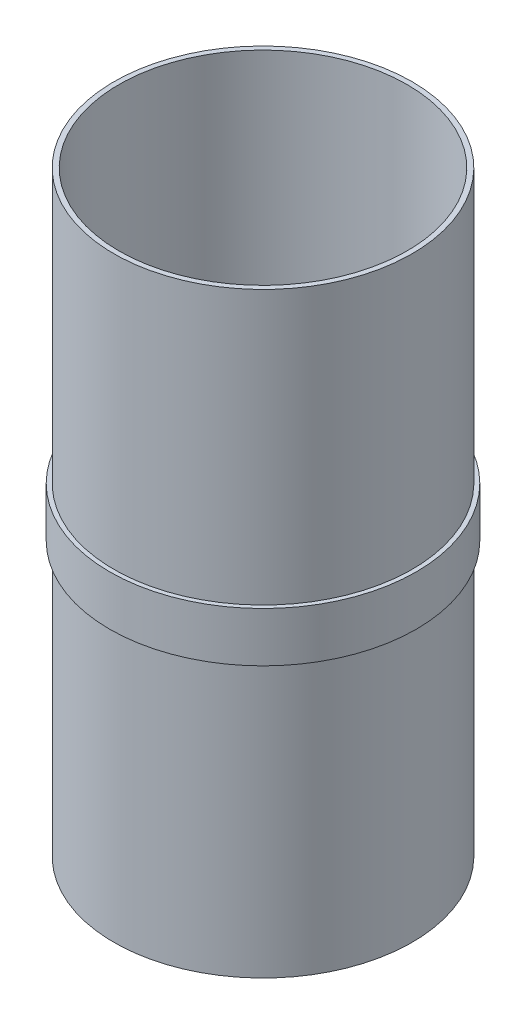
ISO-10303-21;
HEADER;
FILE_DESCRIPTION(('STEP AP214'),'2;1');
FILE_NAME('part.step','',(''),(''),'','','');
FILE_SCHEMA(('AUTOMOTIVE_DESIGN { 1 0 10303 214 1 1 1 1 }'));
ENDSEC;
DATA;
#1=APPLICATION_CONTEXT('core data for automotive mechanical design processes');
#2=APPLICATION_PROTOCOL_DEFINITION('international standard','automotive_design',2000,#1);
#3=PRODUCT_CONTEXT('',#1,'mechanical');
#4=PRODUCT('Part','Part','',(#3));
#5=PRODUCT_RELATED_PRODUCT_CATEGORY('part','',(#4));
#6=PRODUCT_DEFINITION_FORMATION('','',#4);
#7=PRODUCT_DEFINITION_CONTEXT('part definition',#1,'design');
#8=PRODUCT_DEFINITION('design','',#6,#7);
#9=PRODUCT_DEFINITION_SHAPE('','',#8);
#10=(LENGTH_UNIT() NAMED_UNIT(*) SI_UNIT(.MILLI.,.METRE.));
#11=(NAMED_UNIT(*) PLANE_ANGLE_UNIT() SI_UNIT($,.RADIAN.));
#12=(NAMED_UNIT(*) SI_UNIT($,.STERADIAN.) SOLID_ANGLE_UNIT());
#13=UNCERTAINTY_MEASURE_WITH_UNIT(LENGTH_MEASURE(1.E-05),#10,'distance_accuracy_value','');
#14=(GEOMETRIC_REPRESENTATION_CONTEXT(3) GLOBAL_UNCERTAINTY_ASSIGNED_CONTEXT((#13)) GLOBAL_UNIT_ASSIGNED_CONTEXT((#10,
#11,#12)) REPRESENTATION_CONTEXT('',''));
#15=CARTESIAN_POINT('',(0.,0.,0.));
#16=DIRECTION('',(0.,0.,1.));
#17=DIRECTION('',(1.,0.,0.));
#18=AXIS2_PLACEMENT_3D('',#15,#16,#17);
#19=CARTESIAN_POINT('',(0.,12.7,0.));
#20=DIRECTION('',(0.,1.,0.));
#21=DIRECTION('',(0.,0.,1.));
#22=AXIS2_PLACEMENT_3D('',#19,#20,#21);
#23=PLANE('',#22);
#24=CARTESIAN_POINT('',(0.,12.7,0.));
#25=DIRECTION('',(0.,1.,0.));
#26=DIRECTION('',(0.,0.,1.));
#27=AXIS2_PLACEMENT_3D('',#24,#25,#26);
#28=CIRCLE('',#27,78.359);
#29=CARTESIAN_POINT('',(0.,12.7,78.359));
#30=VERTEX_POINT('',#29);
#31=EDGE_CURVE('E10',#30,#30,#28,.T.);
#32=ORIENTED_EDGE('',*,*,#31,.T.);
#33=EDGE_LOOP('',(#32));
#34=FACE_BOUND('',#33,.T.);
#35=CARTESIAN_POINT('',(0.,12.7,0.));
#36=DIRECTION('',(0.,1.,0.));
#37=DIRECTION('',(0.,0.,1.));
#38=AXIS2_PLACEMENT_3D('',#35,#36,#37);
#39=CIRCLE('',#38,76.2);
#40=CARTESIAN_POINT('',(0.,12.7,-76.2));
#41=VERTEX_POINT('',#40);
#42=EDGE_CURVE('E48',#41,#41,#39,.T.);
#43=ORIENTED_EDGE('',*,*,#42,.F.);
#44=EDGE_LOOP('',(#43));
#45=FACE_BOUND('',#44,.T.);
#46=ADVANCED_FACE('F40',(#34,#45),#23,.T.);
#47=CARTESIAN_POINT('',(0.,-12.7,0.));
#48=DIRECTION('',(0.,1.,0.));
#49=DIRECTION('',(0.,0.,1.));
#50=AXIS2_PLACEMENT_3D('',#47,#48,#49);
#51=PLANE('',#50);
#52=CARTESIAN_POINT('',(0.,-12.7,0.));
#53=DIRECTION('',(0.,1.,0.));
#54=DIRECTION('',(0.,0.,1.));
#55=AXIS2_PLACEMENT_3D('',#52,#53,#54);
#56=CIRCLE('',#55,78.359);
#57=CARTESIAN_POINT('',(0.,-12.7,78.359));
#58=VERTEX_POINT('',#57);
#59=EDGE_CURVE('E41',#58,#58,#56,.T.);
#60=ORIENTED_EDGE('',*,*,#59,.F.);
#61=EDGE_LOOP('',(#60));
#62=FACE_BOUND('',#61,.T.);
#63=CARTESIAN_POINT('',(0.,-12.7,0.));
#64=DIRECTION('',(0.,1.,0.));
#65=DIRECTION('',(0.,0.,1.));
#66=AXIS2_PLACEMENT_3D('',#63,#64,#65);
#67=CIRCLE('',#66,76.2);
#68=CARTESIAN_POINT('',(0.,-12.7,-76.2));
#69=VERTEX_POINT('',#68);
#70=EDGE_CURVE('E55',#69,#69,#67,.F.);
#71=ORIENTED_EDGE('',*,*,#70,.F.);
#72=EDGE_LOOP('',(#71));
#73=FACE_BOUND('',#72,.T.);
#74=ADVANCED_FACE('F86',(#62,#73),#51,.F.);
#75=CARTESIAN_POINT('',(0.,12.7,0.));
#76=DIRECTION('',(0.,-1.,0.));
#77=DIRECTION('',(0.,0.,-1.));
#78=AXIS2_PLACEMENT_3D('',#75,#76,#77);
#79=CYLINDRICAL_SURFACE('',#78,78.359);
#80=ORIENTED_EDGE('',*,*,#31,.F.);
#81=EDGE_LOOP('',(#80));
#82=FACE_BOUND('',#81,.T.);
#83=ORIENTED_EDGE('',*,*,#59,.T.);
#84=EDGE_LOOP('',(#83));
#85=FACE_BOUND('',#84,.T.);
#86=ADVANCED_FACE('F39',(#82,#85),#79,.T.);
#87=CARTESIAN_POINT('',(0.,152.4,0.));
#88=DIRECTION('',(0.,-1.,0.));
#89=DIRECTION('',(0.,0.,-1.));
#90=AXIS2_PLACEMENT_3D('',#87,#88,#89);
#91=CYLINDRICAL_SURFACE('',#90,76.2);
#92=CARTESIAN_POINT('',(0.,-152.4,0.));
#93=DIRECTION('',(0.,1.,0.));
#94=DIRECTION('',(0.,0.,1.));
#95=AXIS2_PLACEMENT_3D('',#92,#93,#94);
#96=CIRCLE('',#95,76.2);
#97=CARTESIAN_POINT('',(0.,-152.4,-76.2));
#98=VERTEX_POINT('',#97);
#99=EDGE_CURVE('E57',#98,#98,#96,.T.);
#100=CARTESIAN_POINT('',(0.,-152.4,-76.2));
#101=CARTESIAN_POINT('',(0.,-150.944791666667,-76.2));
#102=CARTESIAN_POINT('',(0.,-149.489583333333,-76.2));
#103=CARTESIAN_POINT('',(0.,-146.579166666667,-76.2));
#104=CARTESIAN_POINT('',(0.,-145.123958333333,-76.2));
#105=CARTESIAN_POINT('',(0.,-142.213541666667,-76.2));
#106=CARTESIAN_POINT('',(0.,-140.758333333333,-76.2));
#107=CARTESIAN_POINT('',(0.,-137.847916666667,-76.2));
#108=CARTESIAN_POINT('',(0.,-136.392708333333,-76.2));
#109=CARTESIAN_POINT('',(0.,-133.482291666667,-76.2));
#110=CARTESIAN_POINT('',(0.,-132.027083333333,-76.2));
#111=CARTESIAN_POINT('',(0.,-129.116666666667,-76.2));
#112=CARTESIAN_POINT('',(0.,-127.661458333333,-76.2));
#113=CARTESIAN_POINT('',(0.,-124.751041666667,-76.2));
#114=CARTESIAN_POINT('',(0.,-123.295833333333,-76.2));
#115=CARTESIAN_POINT('',(0.,-120.385416666667,-76.2));
#116=CARTESIAN_POINT('',(0.,-118.930208333333,-76.2));
#117=CARTESIAN_POINT('',(0.,-116.019791666667,-76.2));
#118=CARTESIAN_POINT('',(0.,-114.564583333333,-76.2));
#119=CARTESIAN_POINT('',(0.,-111.654166666667,-76.2));
#120=CARTESIAN_POINT('',(0.,-110.198958333333,-76.2));
#121=CARTESIAN_POINT('',(0.,-107.288541666667,-76.2));
#122=CARTESIAN_POINT('',(0.,-105.833333333333,-76.2));
#123=CARTESIAN_POINT('',(0.,-102.922916666667,-76.2));
#124=CARTESIAN_POINT('',(0.,-101.467708333333,-76.2));
#125=CARTESIAN_POINT('',(0.,-98.5572916666667,-76.2));
#126=CARTESIAN_POINT('',(0.,-97.1020833333333,-76.2));
#127=CARTESIAN_POINT('',(0.,-94.1916666666667,-76.2));
#128=CARTESIAN_POINT('',(0.,-92.7364583333333,-76.2));
#129=CARTESIAN_POINT('',(0.,-89.8260416666667,-76.2));
#130=CARTESIAN_POINT('',(0.,-88.3708333333333,-76.2));
#131=CARTESIAN_POINT('',(0.,-85.4604166666667,-76.2));
#132=CARTESIAN_POINT('',(0.,-84.0052083333333,-76.2));
#133=CARTESIAN_POINT('',(0.,-81.0947916666667,-76.2));
#134=CARTESIAN_POINT('',(0.,-79.6395833333334,-76.2));
#135=CARTESIAN_POINT('',(0.,-76.7291666666667,-76.2));
#136=CARTESIAN_POINT('',(0.,-75.2739583333334,-76.2));
#137=CARTESIAN_POINT('',(0.,-72.3635416666667,-76.2));
#138=CARTESIAN_POINT('',(0.,-70.9083333333333,-76.2));
#139=CARTESIAN_POINT('',(0.,-67.9979166666667,-76.2));
#140=CARTESIAN_POINT('',(0.,-66.5427083333334,-76.2));
#141=CARTESIAN_POINT('',(0.,-63.6322916666667,-76.2));
#142=CARTESIAN_POINT('',(0.,-62.1770833333333,-76.2));
#143=CARTESIAN_POINT('',(0.,-59.2666666666667,-76.2));
#144=CARTESIAN_POINT('',(0.,-57.8114583333333,-76.2));
#145=CARTESIAN_POINT('',(0.,-54.9010416666667,-76.2));
#146=CARTESIAN_POINT('',(0.,-53.4458333333333,-76.2));
#147=CARTESIAN_POINT('',(0.,-50.5354166666667,-76.2));
#148=CARTESIAN_POINT('',(0.,-49.0802083333333,-76.2));
#149=CARTESIAN_POINT('',(0.,-46.1697916666667,-76.2));
#150=CARTESIAN_POINT('',(0.,-44.7145833333333,-76.2));
#151=CARTESIAN_POINT('',(0.,-41.8041666666667,-76.2));
#152=CARTESIAN_POINT('',(0.,-40.3489583333333,-76.2));
#153=CARTESIAN_POINT('',(0.,-37.4385416666667,-76.2));
#154=CARTESIAN_POINT('',(0.,-35.9833333333333,-76.2));
#155=CARTESIAN_POINT('',(0.,-33.0729166666667,-76.2));
#156=CARTESIAN_POINT('',(0.,-31.6177083333333,-76.2));
#157=CARTESIAN_POINT('',(0.,-28.7072916666667,-76.2));
#158=CARTESIAN_POINT('',(0.,-27.2520833333333,-76.2));
#159=CARTESIAN_POINT('',(0.,-24.3416666666667,-76.2));
#160=CARTESIAN_POINT('',(0.,-22.8864583333333,-76.2));
#161=CARTESIAN_POINT('',(0.,-19.9760416666667,-76.2));
#162=CARTESIAN_POINT('',(0.,-18.5208333333333,-76.2));
#163=CARTESIAN_POINT('',(0.,-15.6104166666667,-76.2));
#164=CARTESIAN_POINT('',(0.,-14.1552083333333,-76.2));
#165=CARTESIAN_POINT('',(0.,-12.7,-76.2));
#166=B_SPLINE_CURVE_WITH_KNOTS('',3,(#100,#101,#102,#103,#104,#105,#106,#107,#108,#109,#110,
#111,#112,#113,#114,#115,#116,#117,#118,#119,#120,#121,#122,#123,#124,#125,#126,#127,#128,#129,
#130,#131,#132,#133,#134,#135,#136,#137,#138,#139,#140,#141,#142,#143,#144,#145,#146,#147,#148,
#149,#150,#151,#152,#153,#154,#155,#156,#157,#158,#159,#160,#161,#162,#163,#164,#165),
.UNSPECIFIED.,.F.,.F.,(4,2,2,2,2,2,2,2,2,2,2,2,2,2,2,2,2,2,2,2,2,2,2,2,2,2,2,2,2,2,2,2,4),(0.,
4.36562499999998,8.73125000000002,13.096875,17.4625,21.828125,26.19375,30.559375,34.925,
39.290625,43.65625,48.021875,52.3875,56.753125,61.11875,65.484375,69.85,74.215625,78.58125,
82.946875,87.3125,91.678125,96.04375,100.409375,104.775,109.140625,113.50625,117.871875,
122.2375,126.603125,130.96875,135.334375,139.7),.UNSPECIFIED.);
#167=EDGE_CURVE('BSEAM74',#98,#69,#166,.T.);
#168=ORIENTED_EDGE('',*,*,#99,.T.);
#169=ORIENTED_EDGE('',*,*,#70,.T.);
#170=ORIENTED_EDGE('',*,*,#167,.T.);
#171=ORIENTED_EDGE('',*,*,#167,.F.);
#172=EDGE_LOOP('',(#168,#170,#169,#171));
#173=FACE_BOUND('',#172,.T.);
#174=ADVANCED_FACE('F74',(#173),#91,.T.);
#175=CARTESIAN_POINT('',(0.,152.4,0.));
#176=DIRECTION('',(0.,1.,0.));
#177=DIRECTION('',(0.,0.,1.));
#178=AXIS2_PLACEMENT_3D('',#175,#176,#177);
#179=PLANE('',#178);
#180=CARTESIAN_POINT('',(0.,152.4,0.));
#181=DIRECTION('',(0.,1.,0.));
#182=DIRECTION('',(0.,0.,1.));
#183=AXIS2_PLACEMENT_3D('',#180,#181,#182);
#184=CIRCLE('',#183,76.2);
#185=CARTESIAN_POINT('',(0.,152.4,-76.2));
#186=VERTEX_POINT('',#185);
#187=EDGE_CURVE('E54',#186,#186,#184,.T.);
#188=ORIENTED_EDGE('',*,*,#187,.T.);
#189=EDGE_LOOP('',(#188));
#190=FACE_BOUND('',#189,.T.);
#191=CARTESIAN_POINT('',(0.,152.4,0.));
#192=DIRECTION('',(0.,1.,0.));
#193=DIRECTION('',(0.,0.,1.));
#194=AXIS2_PLACEMENT_3D('',#191,#192,#193);
#195=CIRCLE('',#194,73.66);
#196=CARTESIAN_POINT('',(0.,152.4,-73.66));
#197=VERTEX_POINT('',#196);
#198=EDGE_CURVE('E56',#197,#197,#195,.T.);
#199=ORIENTED_EDGE('',*,*,#198,.F.);
#200=EDGE_LOOP('',(#199));
#201=FACE_BOUND('',#200,.T.);
#202=ADVANCED_FACE('F72',(#190,#201),#179,.T.);
#203=CARTESIAN_POINT('',(0.,-152.4,0.));
#204=DIRECTION('',(0.,1.,0.));
#205=DIRECTION('',(0.,0.,1.));
#206=AXIS2_PLACEMENT_3D('',#203,#204,#205);
#207=PLANE('',#206);
#208=ORIENTED_EDGE('',*,*,#99,.F.);
#209=EDGE_LOOP('',(#208));
#210=FACE_BOUND('',#209,.T.);
#211=CARTESIAN_POINT('',(0.,-152.4,0.));
#212=DIRECTION('',(0.,1.,0.));
#213=DIRECTION('',(0.,0.,1.));
#214=AXIS2_PLACEMENT_3D('',#211,#212,#213);
#215=CIRCLE('',#214,73.66);
#216=CARTESIAN_POINT('',(0.,-152.4,-73.66));
#217=VERTEX_POINT('',#216);
#218=EDGE_CURVE('E65',#217,#217,#215,.T.);
#219=ORIENTED_EDGE('',*,*,#218,.T.);
#220=EDGE_LOOP('',(#219));
#221=FACE_BOUND('',#220,.T.);
#222=ADVANCED_FACE('F71',(#210,#221),#207,.F.);
#223=CARTESIAN_POINT('',(0.,12.7,-76.2));
#224=CARTESIAN_POINT('',(0.,14.1552083333333,-76.2));
#225=CARTESIAN_POINT('',(0.,15.6104166666667,-76.2));
#226=CARTESIAN_POINT('',(0.,18.5208333333333,-76.2));
#227=CARTESIAN_POINT('',(0.,19.9760416666667,-76.2));
#228=CARTESIAN_POINT('',(0.,22.8864583333333,-76.2));
#229=CARTESIAN_POINT('',(0.,24.3416666666667,-76.2));
#230=CARTESIAN_POINT('',(0.,27.2520833333333,-76.2));
#231=CARTESIAN_POINT('',(0.,28.7072916666667,-76.2));
#232=CARTESIAN_POINT('',(0.,31.6177083333333,-76.2));
#233=CARTESIAN_POINT('',(0.,33.0729166666666,-76.2));
#234=CARTESIAN_POINT('',(0.,35.9833333333333,-76.2));
#235=CARTESIAN_POINT('',(0.,37.4385416666667,-76.2));
#236=CARTESIAN_POINT('',(0.,40.3489583333333,-76.2));
#237=CARTESIAN_POINT('',(0.,41.8041666666667,-76.2));
#238=CARTESIAN_POINT('',(0.,44.7145833333333,-76.2));
#239=CARTESIAN_POINT('',(0.,46.1697916666667,-76.2));
#240=CARTESIAN_POINT('',(0.,49.0802083333333,-76.2));
#241=CARTESIAN_POINT('',(0.,50.5354166666666,-76.2));
#242=CARTESIAN_POINT('',(0.,53.4458333333333,-76.2));
#243=CARTESIAN_POINT('',(0.,54.9010416666667,-76.2));
#244=CARTESIAN_POINT('',(0.,57.8114583333333,-76.2));
#245=CARTESIAN_POINT('',(0.,59.2666666666667,-76.2));
#246=CARTESIAN_POINT('',(0.,62.1770833333333,-76.2));
#247=CARTESIAN_POINT('',(0.,63.6322916666667,-76.2));
#248=CARTESIAN_POINT('',(0.,66.5427083333333,-76.2));
#249=CARTESIAN_POINT('',(0.,67.9979166666667,-76.2));
#250=CARTESIAN_POINT('',(0.,70.9083333333333,-76.2));
#251=CARTESIAN_POINT('',(0.,72.3635416666667,-76.2));
#252=CARTESIAN_POINT('',(0.,75.2739583333333,-76.2));
#253=CARTESIAN_POINT('',(0.,76.7291666666667,-76.2));
#254=CARTESIAN_POINT('',(0.,79.6395833333333,-76.2));
#255=CARTESIAN_POINT('',(0.,81.0947916666667,-76.2));
#256=CARTESIAN_POINT('',(0.,84.0052083333333,-76.2));
#257=CARTESIAN_POINT('',(0.,85.4604166666667,-76.2));
#258=CARTESIAN_POINT('',(0.,88.3708333333333,-76.2));
#259=CARTESIAN_POINT('',(0.,89.8260416666667,-76.2));
#260=CARTESIAN_POINT('',(0.,92.7364583333333,-76.2));
#261=CARTESIAN_POINT('',(0.,94.1916666666667,-76.2));
#262=CARTESIAN_POINT('',(0.,97.1020833333333,-76.2));
#263=CARTESIAN_POINT('',(0.,98.5572916666667,-76.2));
#264=CARTESIAN_POINT('',(0.,101.467708333333,-76.2));
#265=CARTESIAN_POINT('',(0.,102.922916666667,-76.2));
#266=CARTESIAN_POINT('',(0.,105.833333333333,-76.2));
#267=CARTESIAN_POINT('',(0.,107.288541666667,-76.2));
#268=CARTESIAN_POINT('',(0.,110.198958333333,-76.2));
#269=CARTESIAN_POINT('',(0.,111.654166666667,-76.2));
#270=CARTESIAN_POINT('',(0.,114.564583333333,-76.2));
#271=CARTESIAN_POINT('',(0.,116.019791666667,-76.2));
#272=CARTESIAN_POINT('',(0.,118.930208333333,-76.2));
#273=CARTESIAN_POINT('',(0.,120.385416666667,-76.2));
#274=CARTESIAN_POINT('',(0.,123.295833333333,-76.2));
#275=CARTESIAN_POINT('',(0.,124.751041666667,-76.2));
#276=CARTESIAN_POINT('',(0.,127.661458333333,-76.2));
#277=CARTESIAN_POINT('',(0.,129.116666666667,-76.2));
#278=CARTESIAN_POINT('',(0.,132.027083333333,-76.2));
#279=CARTESIAN_POINT('',(0.,133.482291666667,-76.2));
#280=CARTESIAN_POINT('',(0.,136.392708333333,-76.2));
#281=CARTESIAN_POINT('',(0.,137.847916666667,-76.2));
#282=CARTESIAN_POINT('',(0.,140.758333333333,-76.2));
#283=CARTESIAN_POINT('',(0.,142.213541666667,-76.2));
#284=CARTESIAN_POINT('',(0.,145.123958333333,-76.2));
#285=CARTESIAN_POINT('',(0.,146.579166666667,-76.2));
#286=CARTESIAN_POINT('',(0.,149.489583333333,-76.2));
#287=CARTESIAN_POINT('',(0.,150.944791666667,-76.2));
#288=CARTESIAN_POINT('',(0.,152.4,-76.2));
#289=B_SPLINE_CURVE_WITH_KNOTS('',3,(#223,#224,#225,#226,#227,#228,#229,#230,#231,#232,#233,
#234,#235,#236,#237,#238,#239,#240,#241,#242,#243,#244,#245,#246,#247,#248,#249,#250,#251,#252,
#253,#254,#255,#256,#257,#258,#259,#260,#261,#262,#263,#264,#265,#266,#267,#268,#269,#270,#271,
#272,#273,#274,#275,#276,#277,#278,#279,#280,#281,#282,#283,#284,#285,#286,#287,#288),
.UNSPECIFIED.,.F.,.F.,(4,2,2,2,2,2,2,2,2,2,2,2,2,2,2,2,2,2,2,2,2,2,2,2,2,2,2,2,2,2,2,2,4),(0.,
4.36562500000001,8.73125,13.096875,17.4625,21.828125,26.19375,30.559375,34.925,39.290625,
43.65625,48.021875,52.3875,56.753125,61.11875,65.484375,69.85,74.215625,78.58125,82.946875,
87.3125,91.678125,96.04375,100.409375,104.775,109.140625,113.50625,117.871875,122.2375,
126.603125,130.96875,135.334375,139.7),.UNSPECIFIED.);
#290=EDGE_CURVE('BSEAM81',#41,#186,#289,.T.);
#291=ORIENTED_EDGE('',*,*,#42,.T.);
#292=ORIENTED_EDGE('',*,*,#187,.F.);
#293=ORIENTED_EDGE('',*,*,#290,.T.);
#294=ORIENTED_EDGE('',*,*,#290,.F.);
#295=EDGE_LOOP('',(#291,#293,#292,#294));
#296=FACE_BOUND('',#295,.T.);
#297=ADVANCED_FACE('F81',(#296),#91,.T.);
#298=CARTESIAN_POINT('',(0.,152.4,0.));
#299=DIRECTION('',(0.,-1.,0.));
#300=DIRECTION('',(0.,0.,-1.));
#301=AXIS2_PLACEMENT_3D('',#298,#299,#300);
#302=CYLINDRICAL_SURFACE('',#301,73.66);
#303=CARTESIAN_POINT('',(0.,152.4,-73.66));
#304=CARTESIAN_POINT('',(0.,149.225,-73.66));
#305=CARTESIAN_POINT('',(0.,146.05,-73.66));
#306=CARTESIAN_POINT('',(0.,139.7,-73.66));
#307=CARTESIAN_POINT('',(0.,136.525,-73.66));
#308=CARTESIAN_POINT('',(0.,130.175,-73.66));
#309=CARTESIAN_POINT('',(0.,127.,-73.66));
#310=CARTESIAN_POINT('',(0.,120.65,-73.66));
#311=CARTESIAN_POINT('',(0.,117.475,-73.66));
#312=CARTESIAN_POINT('',(0.,111.125,-73.66));
#313=CARTESIAN_POINT('',(0.,107.95,-73.66));
#314=CARTESIAN_POINT('',(0.,101.6,-73.66));
#315=CARTESIAN_POINT('',(0.,98.425,-73.66));
#316=CARTESIAN_POINT('',(0.,92.075,-73.66));
#317=CARTESIAN_POINT('',(0.,88.9,-73.66));
#318=CARTESIAN_POINT('',(0.,82.55,-73.66));
#319=CARTESIAN_POINT('',(0.,79.375,-73.66));
#320=CARTESIAN_POINT('',(0.,73.025,-73.66));
#321=CARTESIAN_POINT('',(0.,69.85,-73.66));
#322=CARTESIAN_POINT('',(0.,63.5,-73.66));
#323=CARTESIAN_POINT('',(0.,60.325,-73.66));
#324=CARTESIAN_POINT('',(0.,53.975,-73.66));
#325=CARTESIAN_POINT('',(0.,50.8,-73.66));
#326=CARTESIAN_POINT('',(0.,44.45,-73.66));
#327=CARTESIAN_POINT('',(0.,41.275,-73.66));
#328=CARTESIAN_POINT('',(0.,34.925,-73.66));
#329=CARTESIAN_POINT('',(0.,31.75,-73.66));
#330=CARTESIAN_POINT('',(0.,25.4,-73.66));
#331=CARTESIAN_POINT('',(0.,22.225,-73.66));
#332=CARTESIAN_POINT('',(0.,15.875,-73.66));
#333=CARTESIAN_POINT('',(0.,12.7,-73.66));
#334=CARTESIAN_POINT('',(0.,6.34999999999998,-73.66));
#335=CARTESIAN_POINT('',(0.,3.17499999999997,-73.66));
#336=CARTESIAN_POINT('',(0.,-3.17500000000003,-73.66));
#337=CARTESIAN_POINT('',(0.,-6.35000000000003,-73.66));
#338=CARTESIAN_POINT('',(0.,-12.7,-73.66));
#339=CARTESIAN_POINT('',(0.,-15.875,-73.66));
#340=CARTESIAN_POINT('',(0.,-22.225,-73.66));
#341=CARTESIAN_POINT('',(0.,-25.4,-73.66));
#342=CARTESIAN_POINT('',(0.,-31.75,-73.66));
#343=CARTESIAN_POINT('',(0.,-34.925,-73.66));
#344=CARTESIAN_POINT('',(0.,-41.275,-73.66));
#345=CARTESIAN_POINT('',(0.,-44.45,-73.66));
#346=CARTESIAN_POINT('',(0.,-50.8,-73.66));
#347=CARTESIAN_POINT('',(0.,-53.975,-73.66));
#348=CARTESIAN_POINT('',(0.,-60.325,-73.66));
#349=CARTESIAN_POINT('',(0.,-63.5,-73.66));
#350=CARTESIAN_POINT('',(0.,-69.85,-73.66));
#351=CARTESIAN_POINT('',(0.,-73.025,-73.66));
#352=CARTESIAN_POINT('',(0.,-79.375,-73.66));
#353=CARTESIAN_POINT('',(0.,-82.5500000000001,-73.66));
#354=CARTESIAN_POINT('',(0.,-88.9,-73.66));
#355=CARTESIAN_POINT('',(0.,-92.0750000000001,-73.66));
#356=CARTESIAN_POINT('',(0.,-98.425,-73.66));
#357=CARTESIAN_POINT('',(0.,-101.6,-73.66));
#358=CARTESIAN_POINT('',(0.,-107.95,-73.66));
#359=CARTESIAN_POINT('',(0.,-111.125,-73.66));
#360=CARTESIAN_POINT('',(0.,-117.475,-73.66));
#361=CARTESIAN_POINT('',(0.,-120.65,-73.66));
#362=CARTESIAN_POINT('',(0.,-127.,-73.66));
#363=CARTESIAN_POINT('',(0.,-130.175,-73.66));
#364=CARTESIAN_POINT('',(0.,-136.525,-73.66));
#365=CARTESIAN_POINT('',(0.,-139.7,-73.66));
#366=CARTESIAN_POINT('',(0.,-146.05,-73.66));
#367=CARTESIAN_POINT('',(0.,-149.225,-73.66));
#368=CARTESIAN_POINT('',(0.,-152.4,-73.66));
#369=B_SPLINE_CURVE_WITH_KNOTS('',3,(#303,#304,#305,#306,#307,#308,#309,#310,#311,#312,#313,
#314,#315,#316,#317,#318,#319,#320,#321,#322,#323,#324,#325,#326,#327,#328,#329,#330,#331,#332,
#333,#334,#335,#336,#337,#338,#339,#340,#341,#342,#343,#344,#345,#346,#347,#348,#349,#350,#351,
#352,#353,#354,#355,#356,#357,#358,#359,#360,#361,#362,#363,#364,#365,#366,#367,#368),
.UNSPECIFIED.,.F.,.F.,(4,2,2,2,2,2,2,2,2,2,2,2,2,2,2,2,2,2,2,2,2,2,2,2,2,2,2,2,2,2,2,2,4),(0.,
9.52499999999998,19.05,28.575,38.1,47.625,57.15,66.675,76.2,85.725,95.25,104.775,114.3,123.825,
133.35,142.875,152.4,161.925,171.45,180.975,190.5,200.025,209.55,219.075,228.6,238.125,247.65,
257.175,266.7,276.225,285.75,295.275,304.8),.UNSPECIFIED.);
#370=EDGE_CURVE('BSEAM68',#197,#217,#369,.T.);
#371=ORIENTED_EDGE('',*,*,#198,.T.);
#372=ORIENTED_EDGE('',*,*,#218,.F.);
#373=ORIENTED_EDGE('',*,*,#370,.T.);
#374=ORIENTED_EDGE('',*,*,#370,.F.);
#375=EDGE_LOOP('',(#371,#373,#372,#374));
#376=FACE_BOUND('',#375,.T.);
#377=ADVANCED_FACE('F68',(#376),#302,.F.);
#378=CLOSED_SHELL('',(#46,#74,#86,#174,#202,#222,#297,#377));
#379=MANIFOLD_SOLID_BREP('B2',#378);
#380=ADVANCED_BREP_SHAPE_REPRESENTATION('',(#18,#379),#14);
#381=SHAPE_DEFINITION_REPRESENTATION(#9,#380);
ENDSEC;
END-ISO-10303-21;
